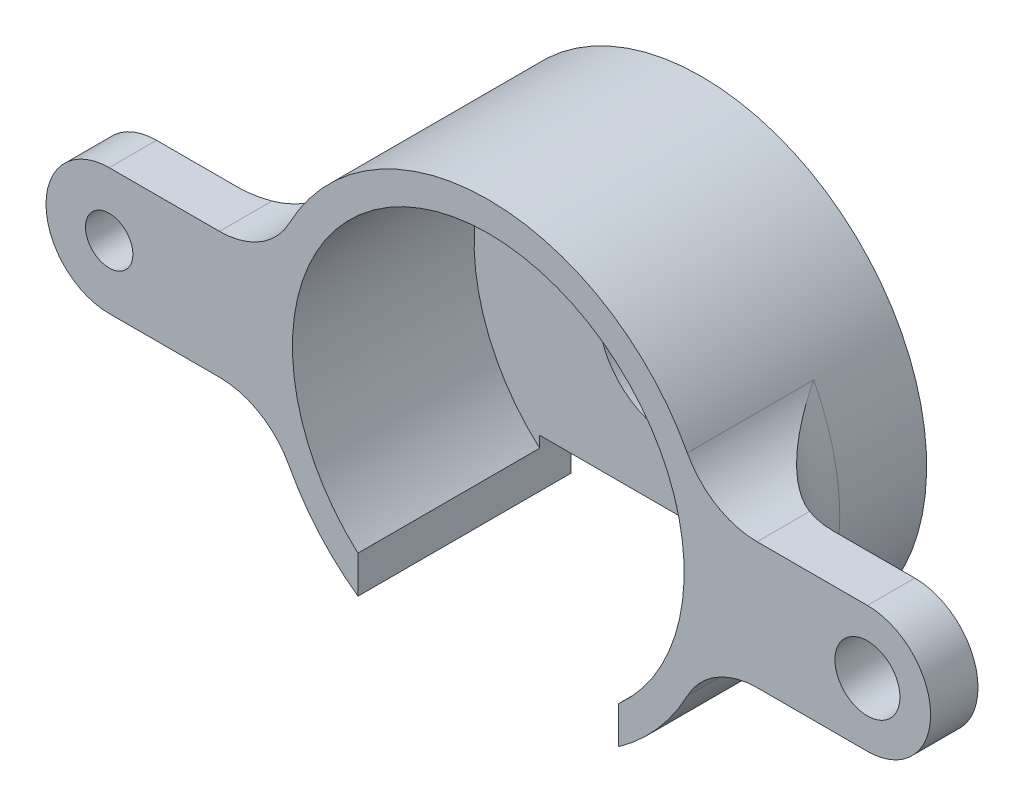
ISO-10303-21;
HEADER;
FILE_DESCRIPTION(('STEP AP214'),'2;1');
FILE_NAME('part.step','',(''),(''),'','','');
FILE_SCHEMA(('AUTOMOTIVE_DESIGN { 1 0 10303 214 1 1 1 1 }'));
ENDSEC;
DATA;
#1=APPLICATION_CONTEXT('core data for automotive mechanical design processes');
#2=APPLICATION_PROTOCOL_DEFINITION('international standard','automotive_design',2000,#1);
#3=PRODUCT_CONTEXT('',#1,'mechanical');
#4=PRODUCT('Part','Part','',(#3));
#5=PRODUCT_RELATED_PRODUCT_CATEGORY('part','',(#4));
#6=PRODUCT_DEFINITION_FORMATION('','',#4);
#7=PRODUCT_DEFINITION_CONTEXT('part definition',#1,'design');
#8=PRODUCT_DEFINITION('design','',#6,#7);
#9=PRODUCT_DEFINITION_SHAPE('','',#8);
#10=(LENGTH_UNIT() NAMED_UNIT(*) SI_UNIT(.MILLI.,.METRE.));
#11=(NAMED_UNIT(*) PLANE_ANGLE_UNIT() SI_UNIT($,.RADIAN.));
#12=(NAMED_UNIT(*) SI_UNIT($,.STERADIAN.) SOLID_ANGLE_UNIT());
#13=UNCERTAINTY_MEASURE_WITH_UNIT(LENGTH_MEASURE(1.E-05),#10,'distance_accuracy_value','');
#14=(GEOMETRIC_REPRESENTATION_CONTEXT(3) GLOBAL_UNCERTAINTY_ASSIGNED_CONTEXT((#13)) GLOBAL_UNIT_ASSIGNED_CONTEXT((#10,
#11,#12)) REPRESENTATION_CONTEXT('',''));
#15=CARTESIAN_POINT('',(0.,0.,0.));
#16=DIRECTION('',(0.,0.,1.));
#17=DIRECTION('',(1.,0.,0.));
#18=AXIS2_PLACEMENT_3D('',#15,#16,#17);
#19=CARTESIAN_POINT('',(0.,0.,11.5));
#20=DIRECTION('',(0.,0.,-1.));
#21=DIRECTION('',(-1.,0.,0.));
#22=AXIS2_PLACEMENT_3D('',#19,#20,#21);
#23=CYLINDRICAL_SURFACE('',#22,14.25);
#24=CARTESIAN_POINT('',(0.,0.,11.5));
#25=DIRECTION('',(0.,0.,1.));
#26=DIRECTION('',(1.,0.,0.));
#27=AXIS2_PLACEMENT_3D('',#24,#25,#26);
#28=CIRCLE('',#27,14.25);
#29=CARTESIAN_POINT('',(-12.5966565751789,-6.66233766233766,11.5));
#30=VERTEX_POINT('',#29);
#31=CARTESIAN_POINT('',(-8.25,-11.6189500386223,11.5));
#32=VERTEX_POINT('',#31);
#33=EDGE_CURVE('E330',#30,#32,#28,.T.);
#34=ORIENTED_EDGE('',*,*,#33,.F.);
#35=DIRECTION('',(0.,0.,-1.));
#36=VECTOR('',#35,1.);
#37=CARTESIAN_POINT('',(-12.5966565751789,-6.66233766233766,11.5));
#38=LINE('',#37,#36);
#39=CARTESIAN_POINT('',(-12.5966565751789,-6.66233766233766,3.5));
#40=VERTEX_POINT('',#39);
#41=EDGE_CURVE('E356',#30,#40,#38,.T.);
#42=ORIENTED_EDGE('',*,*,#41,.T.);
#43=CARTESIAN_POINT('',(0.,0.,3.5));
#44=DIRECTION('',(0.,0.,1.));
#45=DIRECTION('',(1.,0.,0.));
#46=AXIS2_PLACEMENT_3D('',#43,#44,#45);
#47=CIRCLE('',#46,14.25);
#48=CARTESIAN_POINT('',(-12.5966565751789,6.66233766233766,3.5));
#49=VERTEX_POINT('',#48);
#50=EDGE_CURVE('E354',#40,#49,#47,.F.);
#51=ORIENTED_EDGE('',*,*,#50,.T.);
#52=DIRECTION('',(0.,0.,-1.));
#53=VECTOR('',#52,1.);
#54=CARTESIAN_POINT('',(-12.5966565751789,6.66233766233766,11.5));
#55=LINE('',#54,#53);
#56=CARTESIAN_POINT('',(-12.5966565751789,6.66233766233766,11.5));
#57=VERTEX_POINT('',#56);
#58=EDGE_CURVE('E352',#49,#57,#55,.F.);
#59=ORIENTED_EDGE('',*,*,#58,.T.);
#60=CARTESIAN_POINT('',(12.5966565751789,6.66233766233766,11.5));
#61=VERTEX_POINT('',#60);
#62=EDGE_CURVE('E336',#61,#57,#28,.T.);
#63=ORIENTED_EDGE('',*,*,#62,.F.);
#64=DIRECTION('',(0.,0.,-1.));
#65=VECTOR('',#64,1.);
#66=CARTESIAN_POINT('',(12.5966565751789,6.66233766233766,11.5));
#67=LINE('',#66,#65);
#68=CARTESIAN_POINT('',(12.5966565751789,6.66233766233766,3.5));
#69=VERTEX_POINT('',#68);
#70=EDGE_CURVE('E350',#61,#69,#67,.T.);
#71=ORIENTED_EDGE('',*,*,#70,.T.);
#72=CARTESIAN_POINT('',(0.,0.,3.5));
#73=DIRECTION('',(0.,0.,1.));
#74=DIRECTION('',(1.,0.,0.));
#75=AXIS2_PLACEMENT_3D('',#72,#73,#74);
#76=CIRCLE('',#75,14.25);
#77=CARTESIAN_POINT('',(12.5966565751789,-6.66233766233766,3.5));
#78=VERTEX_POINT('',#77);
#79=EDGE_CURVE('E348',#69,#78,#76,.F.);
#80=ORIENTED_EDGE('',*,*,#79,.T.);
#81=DIRECTION('',(0.,0.,-1.));
#82=VECTOR('',#81,1.);
#83=CARTESIAN_POINT('',(12.5966565751789,-6.66233766233766,11.5));
#84=LINE('',#83,#82);
#85=CARTESIAN_POINT('',(12.5966565751789,-6.66233766233766,11.5));
#86=VERTEX_POINT('',#85);
#87=EDGE_CURVE('E346',#78,#86,#84,.F.);
#88=ORIENTED_EDGE('',*,*,#87,.T.);
#89=CARTESIAN_POINT('',(8.25,-11.6189500386223,11.5));
#90=VERTEX_POINT('',#89);
#91=EDGE_CURVE('E333',#90,#86,#28,.T.);
#92=ORIENTED_EDGE('',*,*,#91,.F.);
#93=DIRECTION('',(0.,0.,-1.));
#94=VECTOR('',#93,1.);
#95=CARTESIAN_POINT('',(8.25,-11.6189500386223,11.5));
#96=LINE('',#95,#94);
#97=CARTESIAN_POINT('',(8.25,-11.6189500386223,-2.));
#98=VERTEX_POINT('',#97);
#99=EDGE_CURVE('E303',#90,#98,#96,.T.);
#100=ORIENTED_EDGE('',*,*,#99,.T.);
#101=CARTESIAN_POINT('',(0.,0.,-2.));
#102=DIRECTION('',(0.,0.,-1.));
#103=DIRECTION('',(-1.,0.,0.));
#104=AXIS2_PLACEMENT_3D('',#101,#102,#103);
#105=CIRCLE('',#104,14.25);
#106=CARTESIAN_POINT('',(-8.25,-11.6189500386223,-2.));
#107=VERTEX_POINT('',#106);
#108=EDGE_CURVE('E312',#107,#98,#105,.T.);
#109=ORIENTED_EDGE('',*,*,#108,.F.);
#110=DIRECTION('',(0.,0.,-1.));
#111=VECTOR('',#110,1.);
#112=CARTESIAN_POINT('',(-8.25,-11.6189500386223,11.5));
#113=LINE('',#112,#111);
#114=EDGE_CURVE('E295',#107,#32,#113,.F.);
#115=ORIENTED_EDGE('',*,*,#114,.T.);
#116=EDGE_LOOP('',(#34,#42,#51,#59,#63,#71,#80,#88,#92,#100,#109,#115));
#117=FACE_BOUND('',#116,.T.);
#118=ADVANCED_FACE('F70',(#117),#23,.T.);
#119=CARTESIAN_POINT('',(0.,0.,11.5));
#120=DIRECTION('',(0.,0.,1.));
#121=DIRECTION('',(1.,0.,0.));
#122=AXIS2_PLACEMENT_3D('',#119,#120,#121);
#123=PLANE('',#122);
#124=DIRECTION('',(0.,1.,0.));
#125=VECTOR('',#124,1.);
#126=CARTESIAN_POINT('',(8.25,-16.2559009205842,11.5));
#127=LINE('',#126,#125);
#128=CARTESIAN_POINT('',(8.25,-9.25729442115784,11.5));
#129=VERTEX_POINT('',#128);
#130=EDGE_CURVE('E280',#90,#129,#127,.T.);
#131=ORIENTED_EDGE('',*,*,#130,.F.);
#132=ORIENTED_EDGE('',*,*,#91,.T.);
#133=CARTESIAN_POINT('',(17.0165360752416,-9.,11.5));
#134=DIRECTION('',(0.,0.,1.));
#135=DIRECTION('',(1.,0.,0.));
#136=AXIS2_PLACEMENT_3D('',#133,#134,#135);
#137=CIRCLE('',#136,5.);
#138=CARTESIAN_POINT('',(17.0165360752416,-4.,11.5));
#139=VERTEX_POINT('',#138);
#140=EDGE_CURVE('E12',#86,#139,#137,.F.);
#141=ORIENTED_EDGE('',*,*,#140,.T.);
#142=DIRECTION('',(1.,0.,0.));
#143=VECTOR('',#142,1.);
#144=CARTESIAN_POINT('',(13.6770793665899,-4.,11.5));
#145=LINE('',#144,#143);
#146=CARTESIAN_POINT('',(24.,-4.,11.5));
#147=VERTEX_POINT('',#146);
#148=EDGE_CURVE('E214',#139,#147,#145,.T.);
#149=ORIENTED_EDGE('',*,*,#148,.T.);
#150=CARTESIAN_POINT('',(24.,0.,11.5));
#151=DIRECTION('',(0.,0.,1.));
#152=DIRECTION('',(1.,0.,0.));
#153=AXIS2_PLACEMENT_3D('',#150,#151,#152);
#154=CIRCLE('',#153,4.);
#155=CARTESIAN_POINT('',(24.,4.,11.5));
#156=VERTEX_POINT('',#155);
#157=EDGE_CURVE('E221',#147,#156,#154,.T.);
#158=ORIENTED_EDGE('',*,*,#157,.T.);
#159=DIRECTION('',(1.,0.,0.));
#160=VECTOR('',#159,1.);
#161=CARTESIAN_POINT('',(13.6770793665899,4.,11.5));
#162=LINE('',#161,#160);
#163=CARTESIAN_POINT('',(17.0165360752416,4.,11.5));
#164=VERTEX_POINT('',#163);
#165=EDGE_CURVE('E239',#164,#156,#162,.T.);
#166=ORIENTED_EDGE('',*,*,#165,.F.);
#167=CARTESIAN_POINT('',(17.0165360752416,9.,11.5));
#168=DIRECTION('',(0.,0.,1.));
#169=DIRECTION('',(1.,0.,0.));
#170=AXIS2_PLACEMENT_3D('',#167,#168,#169);
#171=CIRCLE('',#170,5.);
#172=EDGE_CURVE('E485',#164,#61,#171,.F.);
#173=ORIENTED_EDGE('',*,*,#172,.T.);
#174=ORIENTED_EDGE('',*,*,#62,.T.);
#175=CARTESIAN_POINT('',(-17.0165360752416,9.,11.5));
#176=DIRECTION('',(0.,0.,1.));
#177=DIRECTION('',(1.,0.,0.));
#178=AXIS2_PLACEMENT_3D('',#175,#176,#177);
#179=CIRCLE('',#178,5.);
#180=CARTESIAN_POINT('',(-17.0165360752416,4.,11.5));
#181=VERTEX_POINT('',#180);
#182=EDGE_CURVE('E532',#57,#181,#179,.F.);
#183=ORIENTED_EDGE('',*,*,#182,.T.);
#184=DIRECTION('',(1.,0.,0.));
#185=VECTOR('',#184,1.);
#186=CARTESIAN_POINT('',(-24.,4.,11.5));
#187=LINE('',#186,#185);
#188=CARTESIAN_POINT('',(-24.,4.,11.5));
#189=VERTEX_POINT('',#188);
#190=EDGE_CURVE('E264',#189,#181,#187,.T.);
#191=ORIENTED_EDGE('',*,*,#190,.F.);
#192=CARTESIAN_POINT('',(-24.,0.,11.5));
#193=DIRECTION('',(0.,0.,1.));
#194=DIRECTION('',(1.,0.,0.));
#195=AXIS2_PLACEMENT_3D('',#192,#193,#194);
#196=CIRCLE('',#195,4.);
#197=CARTESIAN_POINT('',(-24.,-4.,11.5));
#198=VERTEX_POINT('',#197);
#199=EDGE_CURVE('E257',#189,#198,#196,.T.);
#200=ORIENTED_EDGE('',*,*,#199,.T.);
#201=DIRECTION('',(1.,0.,0.));
#202=VECTOR('',#201,1.);
#203=CARTESIAN_POINT('',(-24.,-4.,11.5));
#204=LINE('',#203,#202);
#205=CARTESIAN_POINT('',(-17.0165360752416,-4.,11.5));
#206=VERTEX_POINT('',#205);
#207=EDGE_CURVE('E273',#198,#206,#204,.T.);
#208=ORIENTED_EDGE('',*,*,#207,.T.);
#209=CARTESIAN_POINT('',(-17.0165360752416,-9.,11.5));
#210=DIRECTION('',(0.,0.,1.));
#211=DIRECTION('',(1.,0.,0.));
#212=AXIS2_PLACEMENT_3D('',#209,#210,#211);
#213=CIRCLE('',#212,5.);
#214=EDGE_CURVE('E366',#206,#30,#213,.F.);
#215=ORIENTED_EDGE('',*,*,#214,.T.);
#216=ORIENTED_EDGE('',*,*,#33,.T.);
#217=DIRECTION('',(0.,-1.,0.));
#218=VECTOR('',#217,1.);
#219=CARTESIAN_POINT('',(-8.25,-16.2559009205842,11.5));
#220=LINE('',#219,#218);
#221=CARTESIAN_POINT('',(-8.25,-9.25729442115784,11.5));
#222=VERTEX_POINT('',#221);
#223=EDGE_CURVE('E283',#222,#32,#220,.T.);
#224=ORIENTED_EDGE('',*,*,#223,.F.);
#225=CARTESIAN_POINT('',(0.,0.,11.5));
#226=DIRECTION('',(0.,0.,1.));
#227=DIRECTION('',(1.,0.,0.));
#228=AXIS2_PLACEMENT_3D('',#225,#226,#227);
#229=CIRCLE('',#228,12.4);
#230=EDGE_CURVE('E327',#129,#222,#229,.T.);
#231=ORIENTED_EDGE('',*,*,#230,.F.);
#232=EDGE_LOOP('',(#131,#132,#141,#149,#158,#166,#173,#174,#183,#191,#200,#208,#215,#216,#224,#231));
#233=FACE_BOUND('',#232,.T.);
#234=CARTESIAN_POINT('',(-24.,0.,11.5));
#235=DIRECTION('',(0.,0.,1.));
#236=DIRECTION('',(1.,0.,0.));
#237=AXIS2_PLACEMENT_3D('',#234,#235,#236);
#238=CIRCLE('',#237,1.5);
#239=CARTESIAN_POINT('',(-22.5,0.,11.5));
#240=VERTEX_POINT('',#239);
#241=EDGE_CURVE('E251',#240,#240,#238,.T.);
#242=ORIENTED_EDGE('',*,*,#241,.F.);
#243=EDGE_LOOP('',(#242));
#244=FACE_BOUND('',#243,.T.);
#245=CARTESIAN_POINT('',(24.,0.,11.5));
#246=DIRECTION('',(0.,0.,1.));
#247=DIRECTION('',(1.,0.,0.));
#248=AXIS2_PLACEMENT_3D('',#245,#246,#247);
#249=CIRCLE('',#248,2.05837794320438);
#250=CARTESIAN_POINT('',(26.0583779432044,0.,11.5));
#251=VERTEX_POINT('',#250);
#252=EDGE_CURVE('E248',#251,#251,#249,.T.);
#253=ORIENTED_EDGE('',*,*,#252,.F.);
#254=EDGE_LOOP('',(#253));
#255=FACE_BOUND('',#254,.T.);
#256=ADVANCED_FACE('F217',(#233,#244,#255),#123,.T.);
#257=CARTESIAN_POINT('',(0.,0.,11.5));
#258=DIRECTION('',(0.,0.,-1.));
#259=DIRECTION('',(-1.,0.,0.));
#260=AXIS2_PLACEMENT_3D('',#257,#258,#259);
#261=CYLINDRICAL_SURFACE('',#260,12.4);
#262=DIRECTION('',(0.,0.,-1.));
#263=VECTOR('',#262,1.);
#264=CARTESIAN_POINT('',(8.25,-9.25729442115784,11.5));
#265=LINE('',#264,#263);
#266=CARTESIAN_POINT('',(8.25,-9.25729442115784,0.));
#267=VERTEX_POINT('',#266);
#268=EDGE_CURVE('E309',#129,#267,#265,.T.);
#269=ORIENTED_EDGE('',*,*,#268,.F.);
#270=ORIENTED_EDGE('',*,*,#230,.T.);
#271=DIRECTION('',(0.,0.,-1.));
#272=VECTOR('',#271,1.);
#273=CARTESIAN_POINT('',(-8.25,-9.25729442115784,11.5));
#274=LINE('',#273,#272);
#275=CARTESIAN_POINT('',(-8.25,-9.25729442115784,0.));
#276=VERTEX_POINT('',#275);
#277=EDGE_CURVE('E301',#276,#222,#274,.F.);
#278=ORIENTED_EDGE('',*,*,#277,.F.);
#279=CARTESIAN_POINT('',(0.,0.,0.));
#280=DIRECTION('',(0.,0.,1.));
#281=DIRECTION('',(1.,0.,0.));
#282=AXIS2_PLACEMENT_3D('',#279,#280,#281);
#283=CIRCLE('',#282,12.4);
#284=EDGE_CURVE('E322',#267,#276,#283,.T.);
#285=ORIENTED_EDGE('',*,*,#284,.F.);
#286=EDGE_LOOP('',(#269,#270,#278,#285));
#287=FACE_BOUND('',#286,.T.);
#288=ADVANCED_FACE('F422',(#287),#261,.F.);
#289=CARTESIAN_POINT('',(0.,0.,0.));
#290=DIRECTION('',(0.,0.,-1.));
#291=DIRECTION('',(-1.,0.,0.));
#292=AXIS2_PLACEMENT_3D('',#289,#290,#291);
#293=PLANE('',#292);
#294=CARTESIAN_POINT('',(0.,0.,0.));
#295=DIRECTION('',(0.,0.,-1.));
#296=DIRECTION('',(-1.,0.,0.));
#297=AXIS2_PLACEMENT_3D('',#294,#295,#296);
#298=CIRCLE('',#297,4.5);
#299=CARTESIAN_POINT('',(-4.5,0.,0.));
#300=VERTEX_POINT('',#299);
#301=EDGE_CURVE('E316',#300,#300,#298,.T.);
#302=ORIENTED_EDGE('',*,*,#301,.T.);
#303=EDGE_LOOP('',(#302));
#304=FACE_BOUND('',#303,.T.);
#305=CARTESIAN_POINT('',(10.,0.,0.));
#306=DIRECTION('',(0.,0.,-1.));
#307=DIRECTION('',(-1.,0.,0.));
#308=AXIS2_PLACEMENT_3D('',#305,#306,#307);
#309=CIRCLE('',#308,1.5);
#310=CARTESIAN_POINT('',(8.5,0.,0.));
#311=VERTEX_POINT('',#310);
#312=EDGE_CURVE('E311',#311,#311,#309,.T.);
#313=ORIENTED_EDGE('',*,*,#312,.T.);
#314=EDGE_LOOP('',(#313));
#315=FACE_BOUND('',#314,.T.);
#316=DIRECTION('',(1.,0.,0.));
#317=VECTOR('',#316,1.);
#318=CARTESIAN_POINT('',(0.,-8.54409907941579,0.));
#319=LINE('',#318,#317);
#320=CARTESIAN_POINT('',(-8.25,-8.54409907941579,0.));
#321=VERTEX_POINT('',#320);
#322=CARTESIAN_POINT('',(8.25,-8.54409907941579,0.));
#323=VERTEX_POINT('',#322);
#324=EDGE_CURVE('E290',#321,#323,#319,.T.);
#325=ORIENTED_EDGE('',*,*,#324,.T.);
#326=DIRECTION('',(0.,-1.,0.));
#327=VECTOR('',#326,1.);
#328=CARTESIAN_POINT('',(8.25,0.,0.));
#329=LINE('',#328,#327);
#330=EDGE_CURVE('E306',#323,#267,#329,.T.);
#331=ORIENTED_EDGE('',*,*,#330,.T.);
#332=ORIENTED_EDGE('',*,*,#284,.T.);
#333=DIRECTION('',(0.,1.,0.));
#334=VECTOR('',#333,1.);
#335=CARTESIAN_POINT('',(-8.25,0.,0.));
#336=LINE('',#335,#334);
#337=EDGE_CURVE('E298',#276,#321,#336,.T.);
#338=ORIENTED_EDGE('',*,*,#337,.T.);
#339=EDGE_LOOP('',(#325,#331,#332,#338));
#340=FACE_BOUND('',#339,.T.);
#341=ADVANCED_FACE('F418',(#304,#315,#340),#293,.F.);
#342=CARTESIAN_POINT('',(10.,0.,-2.));
#343=DIRECTION('',(0.,0.,1.));
#344=DIRECTION('',(1.,0.,0.));
#345=AXIS2_PLACEMENT_3D('',#342,#343,#344);
#346=CYLINDRICAL_SURFACE('',#345,1.5);
#347=CARTESIAN_POINT('',(10.,0.,-2.));
#348=DIRECTION('',(0.,0.,-1.));
#349=DIRECTION('',(-1.,0.,0.));
#350=AXIS2_PLACEMENT_3D('',#347,#348,#349);
#351=CIRCLE('',#350,1.5);
#352=CARTESIAN_POINT('',(8.5,0.,-2.));
#353=VERTEX_POINT('',#352);
#354=EDGE_CURVE('E315',#353,#353,#351,.T.);
#355=ORIENTED_EDGE('',*,*,#354,.T.);
#356=EDGE_LOOP('',(#355));
#357=FACE_BOUND('',#356,.T.);
#358=ORIENTED_EDGE('',*,*,#312,.F.);
#359=EDGE_LOOP('',(#358));
#360=FACE_BOUND('',#359,.T.);
#361=ADVANCED_FACE('F421',(#357,#360),#346,.F.);
#362=CARTESIAN_POINT('',(0.,0.,-2.));
#363=DIRECTION('',(0.,0.,1.));
#364=DIRECTION('',(1.,0.,0.));
#365=AXIS2_PLACEMENT_3D('',#362,#363,#364);
#366=CYLINDRICAL_SURFACE('',#365,4.5);
#367=CARTESIAN_POINT('',(0.,0.,-2.));
#368=DIRECTION('',(0.,0.,-1.));
#369=DIRECTION('',(-1.,0.,0.));
#370=AXIS2_PLACEMENT_3D('',#367,#368,#369);
#371=CIRCLE('',#370,4.5);
#372=CARTESIAN_POINT('',(-4.5,0.,-2.));
#373=VERTEX_POINT('',#372);
#374=EDGE_CURVE('E319',#373,#373,#371,.T.);
#375=ORIENTED_EDGE('',*,*,#374,.T.);
#376=EDGE_LOOP('',(#375));
#377=FACE_BOUND('',#376,.T.);
#378=ORIENTED_EDGE('',*,*,#301,.F.);
#379=EDGE_LOOP('',(#378));
#380=FACE_BOUND('',#379,.T.);
#381=ADVANCED_FACE('F416',(#377,#380),#366,.F.);
#382=CARTESIAN_POINT('',(0.,0.,-2.));
#383=DIRECTION('',(0.,0.,-1.));
#384=DIRECTION('',(-1.,0.,0.));
#385=AXIS2_PLACEMENT_3D('',#382,#383,#384);
#386=PLANE('',#385);
#387=DIRECTION('',(0.,-1.,0.));
#388=VECTOR('',#387,1.);
#389=CARTESIAN_POINT('',(8.25,0.,-2.));
#390=LINE('',#389,#388);
#391=CARTESIAN_POINT('',(8.25,-8.54409907941579,-2.));
#392=VERTEX_POINT('',#391);
#393=EDGE_CURVE('E341',#392,#98,#390,.T.);
#394=ORIENTED_EDGE('',*,*,#393,.F.);
#395=DIRECTION('',(1.,0.,0.));
#396=VECTOR('',#395,1.);
#397=CARTESIAN_POINT('',(0.,-8.54409907941579,-2.));
#398=LINE('',#397,#396);
#399=CARTESIAN_POINT('',(-8.25,-8.54409907941579,-2.));
#400=VERTEX_POINT('',#399);
#401=EDGE_CURVE('E335',#400,#392,#398,.T.);
#402=ORIENTED_EDGE('',*,*,#401,.F.);
#403=DIRECTION('',(0.,1.,0.));
#404=VECTOR('',#403,1.);
#405=CARTESIAN_POINT('',(-8.25,0.,-2.));
#406=LINE('',#405,#404);
#407=EDGE_CURVE('E338',#107,#400,#406,.T.);
#408=ORIENTED_EDGE('',*,*,#407,.F.);
#409=ORIENTED_EDGE('',*,*,#108,.T.);
#410=EDGE_LOOP('',(#394,#402,#408,#409));
#411=FACE_BOUND('',#410,.T.);
#412=ORIENTED_EDGE('',*,*,#354,.F.);
#413=EDGE_LOOP('',(#412));
#414=FACE_BOUND('',#413,.T.);
#415=ORIENTED_EDGE('',*,*,#374,.F.);
#416=EDGE_LOOP('',(#415));
#417=FACE_BOUND('',#416,.T.);
#418=ADVANCED_FACE('F412',(#411,#414,#417),#386,.T.);
#419=CARTESIAN_POINT('',(8.25,-16.2559009205842,-7.5));
#420=DIRECTION('',(1.,0.,0.));
#421=DIRECTION('',(0.,0.,-1.));
#422=AXIS2_PLACEMENT_3D('',#419,#420,#421);
#423=PLANE('',#422);
#424=ORIENTED_EDGE('',*,*,#268,.T.);
#425=ORIENTED_EDGE('',*,*,#330,.F.);
#426=DIRECTION('',(0.,0.,1.));
#427=VECTOR('',#426,1.);
#428=CARTESIAN_POINT('',(8.25,-8.54409907941579,-7.5));
#429=LINE('',#428,#427);
#430=EDGE_CURVE('E286',#392,#323,#429,.T.);
#431=ORIENTED_EDGE('',*,*,#430,.F.);
#432=ORIENTED_EDGE('',*,*,#393,.T.);
#433=ORIENTED_EDGE('',*,*,#99,.F.);
#434=ORIENTED_EDGE('',*,*,#130,.T.);
#435=EDGE_LOOP('',(#424,#425,#431,#432,#433,#434));
#436=FACE_BOUND('',#435,.T.);
#437=ADVANCED_FACE('F405',(#436),#423,.F.);
#438=CARTESIAN_POINT('',(-8.25,-16.2559009205842,-7.5));
#439=DIRECTION('',(-1.,0.,0.));
#440=DIRECTION('',(0.,0.,1.));
#441=AXIS2_PLACEMENT_3D('',#438,#439,#440);
#442=PLANE('',#441);
#443=ORIENTED_EDGE('',*,*,#277,.T.);
#444=ORIENTED_EDGE('',*,*,#223,.T.);
#445=ORIENTED_EDGE('',*,*,#114,.F.);
#446=ORIENTED_EDGE('',*,*,#407,.T.);
#447=DIRECTION('',(0.,0.,1.));
#448=VECTOR('',#447,1.);
#449=CARTESIAN_POINT('',(-8.25,-8.54409907941579,-7.5));
#450=LINE('',#449,#448);
#451=EDGE_CURVE('E287',#400,#321,#450,.T.);
#452=ORIENTED_EDGE('',*,*,#451,.T.);
#453=ORIENTED_EDGE('',*,*,#337,.F.);
#454=EDGE_LOOP('',(#443,#444,#445,#446,#452,#453));
#455=FACE_BOUND('',#454,.T.);
#456=ADVANCED_FACE('F402',(#455),#442,.F.);
#457=CARTESIAN_POINT('',(-8.25,-8.54409907941579,-7.5));
#458=DIRECTION('',(0.,1.,0.));
#459=DIRECTION('',(0.,0.,1.));
#460=AXIS2_PLACEMENT_3D('',#457,#458,#459);
#461=PLANE('',#460);
#462=ORIENTED_EDGE('',*,*,#451,.F.);
#463=ORIENTED_EDGE('',*,*,#401,.T.);
#464=ORIENTED_EDGE('',*,*,#430,.T.);
#465=ORIENTED_EDGE('',*,*,#324,.F.);
#466=EDGE_LOOP('',(#462,#463,#464,#465));
#467=FACE_BOUND('',#466,.T.);
#468=ADVANCED_FACE('F400',(#467),#461,.F.);
#469=CARTESIAN_POINT('',(-24.,0.,8.5));
#470=DIRECTION('',(0.,0.,1.));
#471=DIRECTION('',(1.,0.,0.));
#472=AXIS2_PLACEMENT_3D('',#469,#470,#471);
#473=CYLINDRICAL_SURFACE('',#472,4.);
#474=ORIENTED_EDGE('',*,*,#199,.F.);
#475=DIRECTION('',(0.,0.,1.));
#476=VECTOR('',#475,1.);
#477=CARTESIAN_POINT('',(-24.,4.,8.5));
#478=LINE('',#477,#476);
#479=CARTESIAN_POINT('',(-24.,4.,8.5));
#480=VERTEX_POINT('',#479);
#481=EDGE_CURVE('E278',#480,#189,#478,.T.);
#482=ORIENTED_EDGE('',*,*,#481,.F.);
#483=CARTESIAN_POINT('',(-24.,0.,8.5));
#484=DIRECTION('',(0.,0.,1.));
#485=DIRECTION('',(1.,0.,0.));
#486=AXIS2_PLACEMENT_3D('',#483,#484,#485);
#487=CIRCLE('',#486,4.);
#488=CARTESIAN_POINT('',(-24.,-4.,8.5));
#489=VERTEX_POINT('',#488);
#490=EDGE_CURVE('E260',#480,#489,#487,.T.);
#491=ORIENTED_EDGE('',*,*,#490,.T.);
#492=DIRECTION('',(0.,0.,1.));
#493=VECTOR('',#492,1.);
#494=CARTESIAN_POINT('',(-24.,-4.,8.5));
#495=LINE('',#494,#493);
#496=EDGE_CURVE('E270',#489,#198,#495,.T.);
#497=ORIENTED_EDGE('',*,*,#496,.T.);
#498=EDGE_LOOP('',(#474,#482,#491,#497));
#499=FACE_BOUND('',#498,.T.);
#500=ADVANCED_FACE('F397',(#499),#473,.T.);
#501=CARTESIAN_POINT('',(-24.,4.,8.5));
#502=DIRECTION('',(0.,-1.,0.));
#503=DIRECTION('',(0.,0.,-1.));
#504=AXIS2_PLACEMENT_3D('',#501,#502,#503);
#505=PLANE('',#504);
#506=ORIENTED_EDGE('',*,*,#190,.T.);
#507=DIRECTION('',(0.,0.,1.));
#508=VECTOR('',#507,1.);
#509=CARTESIAN_POINT('',(-17.0165360752416,4.,8.5));
#510=LINE('',#509,#508);
#511=CARTESIAN_POINT('',(-17.0165360752416,4.,8.17635810186876));
#512=VERTEX_POINT('',#511);
#513=EDGE_CURVE('E360',#181,#512,#510,.F.);
#514=ORIENTED_EDGE('',*,*,#513,.T.);
#515=CARTESIAN_POINT('',(-17.0165360752416,4.,8.17635810186876));
#516=CARTESIAN_POINT('',(-17.161873898164,4.,8.22991384078425));
#517=CARTESIAN_POINT('',(-17.3095882895959,4.,8.27700937210215));
#518=CARTESIAN_POINT('',(-17.6074423507247,4.,8.35767135598129));
#519=CARTESIAN_POINT('',(-17.7575545160994,4.,8.39133938535494));
#520=CARTESIAN_POINT('',(-18.0601616612048,4.,8.44537356076521));
#521=CARTESIAN_POINT('',(-18.21265674324,4.,8.46573913407929));
#522=CARTESIAN_POINT('',(-18.520036257062,4.,8.49311269132856));
#523=CARTESIAN_POINT('',(-18.6749300476301,4.,8.50001558130392));
#524=CARTESIAN_POINT('',(-18.8298300576506,4.,8.5));
#525=B_SPLINE_CURVE_WITH_KNOTS('',3,(#515,#516,#517,#518,#519,#520,#521,#522,#523,#524),
.UNSPECIFIED.,.F.,.F.,(4,2,2,2,4),(0.,0.464516793304799,0.925449725128462,1.38640250060249,
1.85093943978702),.UNSPECIFIED.);
#526=CARTESIAN_POINT('',(-18.8298300576505,4.,8.5));
#527=VERTEX_POINT('',#526);
#528=EDGE_CURVE('E377',#512,#527,#525,.T.);
#529=ORIENTED_EDGE('',*,*,#528,.T.);
#530=DIRECTION('',(1.,0.,0.));
#531=VECTOR('',#530,1.);
#532=CARTESIAN_POINT('',(-24.,4.,8.5));
#533=LINE('',#532,#531);
#534=EDGE_CURVE('E267',#480,#527,#533,.T.);
#535=ORIENTED_EDGE('',*,*,#534,.F.);
#536=ORIENTED_EDGE('',*,*,#481,.T.);
#537=EDGE_LOOP('',(#506,#514,#529,#535,#536));
#538=FACE_BOUND('',#537,.T.);
#539=ADVANCED_FACE('F393',(#538),#505,.F.);
#540=CARTESIAN_POINT('',(-24.,-4.,8.5));
#541=DIRECTION('',(0.,-1.,0.));
#542=DIRECTION('',(0.,0.,-1.));
#543=AXIS2_PLACEMENT_3D('',#540,#541,#542);
#544=PLANE('',#543);
#545=DIRECTION('',(1.,0.,0.));
#546=VECTOR('',#545,1.);
#547=CARTESIAN_POINT('',(-24.,-4.,8.5));
#548=LINE('',#547,#546);
#549=CARTESIAN_POINT('',(-18.8298300576505,-4.,8.5));
#550=VERTEX_POINT('',#549);
#551=EDGE_CURVE('E263',#489,#550,#548,.T.);
#552=ORIENTED_EDGE('',*,*,#551,.T.);
#553=CARTESIAN_POINT('',(-18.8298300576505,-4.00000000000004,8.5));
#554=CARTESIAN_POINT('',(-18.6749300476301,-4.00000000000001,8.50001558130392));
#555=CARTESIAN_POINT('',(-18.520036257062,-4.,8.49311269132856));
#556=CARTESIAN_POINT('',(-18.21265674324,-4.,8.46573913407929));
#557=CARTESIAN_POINT('',(-18.0601616612048,-4.,8.44537356076521));
#558=CARTESIAN_POINT('',(-17.7575545160994,-4.,8.39133938535494));
#559=CARTESIAN_POINT('',(-17.6074423507247,-4.,8.35767135598129));
#560=CARTESIAN_POINT('',(-17.3095882895959,-4.,8.27700937210215));
#561=CARTESIAN_POINT('',(-17.161873898164,-4.,8.22991384078425));
#562=CARTESIAN_POINT('',(-17.0165360752416,-4.,8.17635810186876));
#563=B_SPLINE_CURVE_WITH_KNOTS('',3,(#553,#554,#555,#556,#557,#558,#559,#560,#561,#562),
.UNSPECIFIED.,.F.,.F.,(4,2,2,2,4),(0.,0.464536939184529,0.925489714658558,1.38642264648222,
1.85093943978701),.UNSPECIFIED.);
#564=CARTESIAN_POINT('',(-17.0165360752416,-4.,8.17635810186876));
#565=VERTEX_POINT('',#564);
#566=EDGE_CURVE('E368',#550,#565,#563,.T.);
#567=ORIENTED_EDGE('',*,*,#566,.T.);
#568=DIRECTION('',(0.,0.,-1.));
#569=VECTOR('',#568,1.);
#570=CARTESIAN_POINT('',(-17.0165360752416,-4.,8.5));
#571=LINE('',#570,#569);
#572=EDGE_CURVE('E343',#565,#206,#571,.F.);
#573=ORIENTED_EDGE('',*,*,#572,.T.);
#574=ORIENTED_EDGE('',*,*,#207,.F.);
#575=ORIENTED_EDGE('',*,*,#496,.F.);
#576=EDGE_LOOP('',(#552,#567,#573,#574,#575));
#577=FACE_BOUND('',#576,.T.);
#578=ADVANCED_FACE('F388',(#577),#544,.T.);
#579=CARTESIAN_POINT('',(-24.,0.,8.5));
#580=DIRECTION('',(0.,0.,1.));
#581=DIRECTION('',(1.,0.,0.));
#582=AXIS2_PLACEMENT_3D('',#579,#580,#581);
#583=PLANE('',#582);
#584=CARTESIAN_POINT('',(-24.,0.,8.5));
#585=DIRECTION('',(0.,0.,1.));
#586=DIRECTION('',(1.,0.,0.));
#587=AXIS2_PLACEMENT_3D('',#584,#585,#586);
#588=CIRCLE('',#587,1.5);
#589=CARTESIAN_POINT('',(-22.5,0.,8.5));
#590=VERTEX_POINT('',#589);
#591=EDGE_CURVE('E254',#590,#590,#588,.T.);
#592=ORIENTED_EDGE('',*,*,#591,.T.);
#593=EDGE_LOOP('',(#592));
#594=FACE_BOUND('',#593,.T.);
#595=ORIENTED_EDGE('',*,*,#534,.T.);
#596=CARTESIAN_POINT('',(0.,0.,8.5));
#597=DIRECTION('',(0.,0.,1.));
#598=DIRECTION('',(1.,0.,0.));
#599=AXIS2_PLACEMENT_3D('',#596,#597,#598);
#600=CIRCLE('',#599,19.25);
#601=EDGE_CURVE('E358',#527,#550,#600,.T.);
#602=ORIENTED_EDGE('',*,*,#601,.T.);
#603=ORIENTED_EDGE('',*,*,#551,.F.);
#604=ORIENTED_EDGE('',*,*,#490,.F.);
#605=EDGE_LOOP('',(#595,#602,#603,#604));
#606=FACE_BOUND('',#605,.T.);
#607=ADVANCED_FACE('F392',(#594,#606),#583,.F.);
#608=CARTESIAN_POINT('',(-24.,0.,8.5));
#609=DIRECTION('',(0.,0.,1.));
#610=DIRECTION('',(1.,0.,0.));
#611=AXIS2_PLACEMENT_3D('',#608,#609,#610);
#612=CYLINDRICAL_SURFACE('',#611,1.5);
#613=ORIENTED_EDGE('',*,*,#591,.F.);
#614=EDGE_LOOP('',(#613));
#615=FACE_BOUND('',#614,.T.);
#616=ORIENTED_EDGE('',*,*,#241,.T.);
#617=EDGE_LOOP('',(#616));
#618=FACE_BOUND('',#617,.T.);
#619=ADVANCED_FACE('F495',(#615,#618),#612,.F.);
#620=CARTESIAN_POINT('',(13.6770793665899,4.,8.5));
#621=DIRECTION('',(0.,-1.,0.));
#622=DIRECTION('',(1.,0.,0.));
#623=AXIS2_PLACEMENT_3D('',#620,#621,#622);
#624=PLANE('',#623);
#625=DIRECTION('',(1.,0.,0.));
#626=VECTOR('',#625,1.);
#627=CARTESIAN_POINT('',(13.6770793665899,4.,8.5));
#628=LINE('',#627,#626);
#629=CARTESIAN_POINT('',(18.8298300576505,4.,8.5));
#630=VERTEX_POINT('',#629);
#631=CARTESIAN_POINT('',(24.,4.,8.5));
#632=VERTEX_POINT('',#631);
#633=EDGE_CURVE('E224',#630,#632,#628,.T.);
#634=ORIENTED_EDGE('',*,*,#633,.F.);
#635=CARTESIAN_POINT('',(18.8298300576505,4.,8.5));
#636=CARTESIAN_POINT('',(18.6749300476301,4.,8.50001558130392));
#637=CARTESIAN_POINT('',(18.520036257062,4.,8.49311269132856));
#638=CARTESIAN_POINT('',(18.21265674324,4.,8.46573913407929));
#639=CARTESIAN_POINT('',(18.0601616612048,4.,8.44537356076521));
#640=CARTESIAN_POINT('',(17.7575545160994,4.,8.39133938535494));
#641=CARTESIAN_POINT('',(17.6074423507247,4.,8.35767135598129));
#642=CARTESIAN_POINT('',(17.3095882895959,4.,8.27700937210215));
#643=CARTESIAN_POINT('',(17.161873898164,4.,8.22991384078425));
#644=CARTESIAN_POINT('',(17.0165360752416,4.,8.17635810186876));
#645=B_SPLINE_CURVE_WITH_KNOTS('',3,(#635,#636,#637,#638,#639,#640,#641,#642,#643,#644),
.UNSPECIFIED.,.F.,.F.,(4,2,2,2,4),(0.,0.464536939184533,0.925489714658562,1.38642264648222,
1.85093943978702),.UNSPECIFIED.);
#646=CARTESIAN_POINT('',(17.0165360752416,4.,8.17635810186876));
#647=VERTEX_POINT('',#646);
#648=EDGE_CURVE('E478',#630,#647,#645,.T.);
#649=ORIENTED_EDGE('',*,*,#648,.T.);
#650=DIRECTION('',(0.,0.,1.));
#651=VECTOR('',#650,1.);
#652=CARTESIAN_POINT('',(17.0165360752416,4.,11.5));
#653=LINE('',#652,#651);
#654=EDGE_CURVE('E100',#647,#164,#653,.T.);
#655=ORIENTED_EDGE('',*,*,#654,.T.);
#656=ORIENTED_EDGE('',*,*,#165,.T.);
#657=DIRECTION('',(0.,0.,1.));
#658=VECTOR('',#657,1.);
#659=CARTESIAN_POINT('',(24.,4.,8.5));
#660=LINE('',#659,#658);
#661=EDGE_CURVE('E234',#632,#156,#660,.T.);
#662=ORIENTED_EDGE('',*,*,#661,.F.);
#663=EDGE_LOOP('',(#634,#649,#655,#656,#662));
#664=FACE_BOUND('',#663,.T.);
#665=ADVANCED_FACE('F491',(#664),#624,.F.);
#666=CARTESIAN_POINT('',(24.,0.,8.5));
#667=DIRECTION('',(0.,0.,1.));
#668=DIRECTION('',(1.,0.,0.));
#669=AXIS2_PLACEMENT_3D('',#666,#667,#668);
#670=CYLINDRICAL_SURFACE('',#669,4.);
#671=ORIENTED_EDGE('',*,*,#157,.F.);
#672=DIRECTION('',(0.,0.,1.));
#673=VECTOR('',#672,1.);
#674=CARTESIAN_POINT('',(24.,-4.,8.5));
#675=LINE('',#674,#673);
#676=CARTESIAN_POINT('',(24.,-4.,8.5));
#677=VERTEX_POINT('',#676);
#678=EDGE_CURVE('E227',#677,#147,#675,.T.);
#679=ORIENTED_EDGE('',*,*,#678,.F.);
#680=CARTESIAN_POINT('',(24.,0.,8.5));
#681=DIRECTION('',(0.,0.,1.));
#682=DIRECTION('',(1.,0.,0.));
#683=AXIS2_PLACEMENT_3D('',#680,#681,#682);
#684=CIRCLE('',#683,4.);
#685=EDGE_CURVE('E245',#677,#632,#684,.T.);
#686=ORIENTED_EDGE('',*,*,#685,.T.);
#687=ORIENTED_EDGE('',*,*,#661,.T.);
#688=EDGE_LOOP('',(#671,#679,#686,#687));
#689=FACE_BOUND('',#688,.T.);
#690=ADVANCED_FACE('F237',(#689),#670,.T.);
#691=CARTESIAN_POINT('',(13.6770793665899,-4.,8.5));
#692=DIRECTION('',(0.,-1.,0.));
#693=DIRECTION('',(1.,0.,0.));
#694=AXIS2_PLACEMENT_3D('',#691,#692,#693);
#695=PLANE('',#694);
#696=ORIENTED_EDGE('',*,*,#148,.F.);
#697=DIRECTION('',(0.,0.,-1.));
#698=VECTOR('',#697,1.);
#699=CARTESIAN_POINT('',(17.0165360752416,-4.,8.5));
#700=LINE('',#699,#698);
#701=CARTESIAN_POINT('',(17.0165360752416,-4.,8.17635810186876));
#702=VERTEX_POINT('',#701);
#703=EDGE_CURVE('E92',#139,#702,#700,.T.);
#704=ORIENTED_EDGE('',*,*,#703,.T.);
#705=CARTESIAN_POINT('',(17.0165360752416,-4.,8.17635810186876));
#706=CARTESIAN_POINT('',(17.161873898164,-4.,8.22991384078425));
#707=CARTESIAN_POINT('',(17.3095882895959,-4.,8.27700937210215));
#708=CARTESIAN_POINT('',(17.6074423507247,-4.,8.35767135598129));
#709=CARTESIAN_POINT('',(17.7575545160994,-4.,8.39133938535494));
#710=CARTESIAN_POINT('',(18.0601616612048,-4.,8.44537356076521));
#711=CARTESIAN_POINT('',(18.21265674324,-4.,8.46573913407929));
#712=CARTESIAN_POINT('',(18.520036257062,-4.,8.49311269132856));
#713=CARTESIAN_POINT('',(18.6749300476301,-4.,8.50001558130392));
#714=CARTESIAN_POINT('',(18.8298300576506,-4.,8.5));
#715=B_SPLINE_CURVE_WITH_KNOTS('',3,(#705,#706,#707,#708,#709,#710,#711,#712,#713,#714),
.UNSPECIFIED.,.F.,.F.,(4,2,2,2,4),(0.,0.464516793304799,0.925449725128462,1.38640250060249,
1.85093943978702),.UNSPECIFIED.);
#716=CARTESIAN_POINT('',(18.8298300576505,-4.,8.5));
#717=VERTEX_POINT('',#716);
#718=EDGE_CURVE('E84',#702,#717,#715,.T.);
#719=ORIENTED_EDGE('',*,*,#718,.T.);
#720=DIRECTION('',(1.,0.,0.));
#721=VECTOR('',#720,1.);
#722=CARTESIAN_POINT('',(13.6770793665899,-4.,8.5));
#723=LINE('',#722,#721);
#724=EDGE_CURVE('E230',#717,#677,#723,.T.);
#725=ORIENTED_EDGE('',*,*,#724,.T.);
#726=ORIENTED_EDGE('',*,*,#678,.T.);
#727=EDGE_LOOP('',(#696,#704,#719,#725,#726));
#728=FACE_BOUND('',#727,.T.);
#729=ADVANCED_FACE('F228',(#728),#695,.T.);
#730=CARTESIAN_POINT('',(0.,0.,8.5));
#731=DIRECTION('',(0.,0.,1.));
#732=DIRECTION('',(1.,0.,0.));
#733=AXIS2_PLACEMENT_3D('',#730,#731,#732);
#734=PLANE('',#733);
#735=CARTESIAN_POINT('',(24.,0.,8.5));
#736=DIRECTION('',(0.,0.,1.));
#737=DIRECTION('',(1.,0.,0.));
#738=AXIS2_PLACEMENT_3D('',#735,#736,#737);
#739=CIRCLE('',#738,2.05837794320438);
#740=CARTESIAN_POINT('',(26.0583779432044,0.,8.5));
#741=VERTEX_POINT('',#740);
#742=EDGE_CURVE('E241',#741,#741,#739,.T.);
#743=ORIENTED_EDGE('',*,*,#742,.T.);
#744=EDGE_LOOP('',(#743));
#745=FACE_BOUND('',#744,.T.);
#746=ORIENTED_EDGE('',*,*,#724,.F.);
#747=CARTESIAN_POINT('',(0.,0.,8.5));
#748=DIRECTION('',(0.,0.,1.));
#749=DIRECTION('',(1.,0.,0.));
#750=AXIS2_PLACEMENT_3D('',#747,#748,#749);
#751=CIRCLE('',#750,19.25);
#752=EDGE_CURVE('E363',#717,#630,#751,.T.);
#753=ORIENTED_EDGE('',*,*,#752,.T.);
#754=ORIENTED_EDGE('',*,*,#633,.T.);
#755=ORIENTED_EDGE('',*,*,#685,.F.);
#756=EDGE_LOOP('',(#746,#753,#754,#755));
#757=FACE_BOUND('',#756,.T.);
#758=ADVANCED_FACE('F501',(#745,#757),#734,.F.);
#759=CARTESIAN_POINT('',(24.,0.,8.5));
#760=DIRECTION('',(0.,0.,1.));
#761=DIRECTION('',(1.,0.,0.));
#762=AXIS2_PLACEMENT_3D('',#759,#760,#761);
#763=CYLINDRICAL_SURFACE('',#762,2.05837794320438);
#764=ORIENTED_EDGE('',*,*,#742,.F.);
#765=EDGE_LOOP('',(#764));
#766=FACE_BOUND('',#765,.T.);
#767=ORIENTED_EDGE('',*,*,#252,.T.);
#768=EDGE_LOOP('',(#767));
#769=FACE_BOUND('',#768,.T.);
#770=ADVANCED_FACE('F465',(#766,#769),#763,.F.);
#771=CARTESIAN_POINT('',(-17.0165360752416,9.,11.5));
#772=DIRECTION('',(0.,0.,-1.));
#773=DIRECTION('',(-1.,0.,0.));
#774=AXIS2_PLACEMENT_3D('',#771,#772,#773);
#775=CYLINDRICAL_SURFACE('',#774,5.);
#776=ORIENTED_EDGE('',*,*,#182,.F.);
#777=ORIENTED_EDGE('',*,*,#58,.F.);
#778=CARTESIAN_POINT('',(-17.0165360752416,4.,8.17635810186876));
#779=CARTESIAN_POINT('',(-16.8799139560784,3.99998596276398,8.12606013129485));
#780=CARTESIAN_POINT('',(-16.7453778190466,4.00559713838729,8.07050147035477));
#781=CARTESIAN_POINT('',(-16.4816433930906,4.02694169136022,7.95022484979747));
#782=CARTESIAN_POINT('',(-16.3524336718605,4.04265204384503,7.88552798528382));
#783=CARTESIAN_POINT('',(-16.1015724039315,4.08280732689522,7.74901322121573));
#784=CARTESIAN_POINT('',(-15.9798430714809,4.10713304639945,7.67730172897059));
#785=CARTESIAN_POINT('',(-15.7424184109293,4.16352195701116,7.52711863935742));
#786=CARTESIAN_POINT('',(-15.6267273423603,4.19559052272955,7.44864237073091));
#787=CARTESIAN_POINT('',(-15.3657229865943,4.2778130364325,7.26001739377208));
#788=CARTESIAN_POINT('',(-15.2227299521651,4.33047305839676,7.14774971108747));
#789=CARTESIAN_POINT('',(-14.947652556389,4.44566502077281,6.91527077366588));
#790=CARTESIAN_POINT('',(-14.8155703491583,4.50819890351205,6.7950579587204));
#791=CARTESIAN_POINT('',(-14.5611280054958,4.64204494273878,6.54750652626603));
#792=CARTESIAN_POINT('',(-14.4388386313151,4.71341289581064,6.42012570863159));
#793=CARTESIAN_POINT('',(-14.204463192201,4.86338249892197,6.16030955474195));
#794=CARTESIAN_POINT('',(-14.0923804609423,4.94198649564747,6.02787258695891));
#795=CARTESIAN_POINT('',(-13.8341240095172,5.13886700594745,5.70417581602145));
#796=CARTESIAN_POINT('',(-13.6927223356784,5.26023517237631,5.51098240204929));
#797=CARTESIAN_POINT('',(-13.4278577373122,5.51360033464989,5.11927849267643));
#798=CARTESIAN_POINT('',(-13.3044037052697,5.64560254932991,4.92076541885107));
#799=CARTESIAN_POINT('',(-13.0748202818534,5.91866838941244,4.52105187460946));
#800=CARTESIAN_POINT('',(-12.9686427360771,6.05970524632912,4.31986062563049));
#801=CARTESIAN_POINT('',(-12.772619183584,6.35049304709929,3.91600124756057));
#802=CARTESIAN_POINT('',(-12.6827633258371,6.50023866220062,3.71333408661194));
#803=CARTESIAN_POINT('',(-12.5995339649976,6.65690338430426,3.50714686425492));
#804=CARTESIAN_POINT('',(-12.5980940152931,6.65961987001662,3.50357342148542));
#805=CARTESIAN_POINT('',(-12.5966565751789,6.66233766233766,3.5));
#806=B_SPLINE_CURVE_WITH_KNOTS('',3,(#778,#779,#780,#781,#782,#783,#784,#785,#786,#787,#788,
#789,#790,#791,#792,#793,#794,#795,#796,#797,#798,#799,#800,#801,#802,#803,#804,#805),
.UNSPECIFIED.,.F.,.F.,(4,2,2,2,2,2,2,2,2,2,2,2,2,4),(0.,0.436339942928946,0.871688596425005,
1.30123464307848,1.73107971592033,2.29801522259469,2.86506239272668,3.43589373491971,
4.0069108572312,4.81113599023744,5.61575824300005,6.41809787800926,7.21995163639437,
7.23409377457701),.UNSPECIFIED.);
#807=EDGE_CURVE('E449',#512,#49,#806,.T.);
#808=ORIENTED_EDGE('',*,*,#807,.F.);
#809=ORIENTED_EDGE('',*,*,#513,.F.);
#810=EDGE_LOOP('',(#776,#777,#808,#809));
#811=FACE_BOUND('',#810,.T.);
#812=ADVANCED_FACE('F462',(#811),#775,.F.);
#813=CARTESIAN_POINT('',(0.,0.,3.5));
#814=DIRECTION('',(0.,0.,1.));
#815=DIRECTION('',(1.,0.,0.));
#816=AXIS2_PLACEMENT_3D('',#813,#814,#815);
#817=TOROIDAL_SURFACE('',#816,19.25,5.);
#818=ORIENTED_EDGE('',*,*,#807,.T.);
#819=ORIENTED_EDGE('',*,*,#50,.F.);
#820=CARTESIAN_POINT('',(-17.0165360752416,-4.,8.17635810186876));
#821=CARTESIAN_POINT('',(-16.8799139560784,-3.99998596276398,8.12606013129485));
#822=CARTESIAN_POINT('',(-16.7453778190466,-4.00559713838729,8.07050147035477));
#823=CARTESIAN_POINT('',(-16.4816433930906,-4.02694169136022,7.95022484979747));
#824=CARTESIAN_POINT('',(-16.3524336718605,-4.04265204384503,7.88552798528382));
#825=CARTESIAN_POINT('',(-16.1015724039315,-4.08280732689522,7.74901322121573));
#826=CARTESIAN_POINT('',(-15.9798430714809,-4.10713304639945,7.67730172897059));
#827=CARTESIAN_POINT('',(-15.7424184109293,-4.16352195701116,7.52711863935742));
#828=CARTESIAN_POINT('',(-15.6267273423603,-4.19559052272955,7.44864237073091));
#829=CARTESIAN_POINT('',(-15.3657229865943,-4.2778130364325,7.26001739377208));
#830=CARTESIAN_POINT('',(-15.2227299521651,-4.33047305839676,7.14774971108747));
#831=CARTESIAN_POINT('',(-14.947652556389,-4.44566502077281,6.91527077366588));
#832=CARTESIAN_POINT('',(-14.8155703491583,-4.50819890351205,6.7950579587204));
#833=CARTESIAN_POINT('',(-14.5611280054958,-4.64204494273878,6.54750652626603));
#834=CARTESIAN_POINT('',(-14.4388386313151,-4.71341289581064,6.42012570863159));
#835=CARTESIAN_POINT('',(-14.204463192201,-4.86338249892197,6.16030955474195));
#836=CARTESIAN_POINT('',(-14.0923804609423,-4.94198649564747,6.02787258695891));
#837=CARTESIAN_POINT('',(-13.8341240095172,-5.13886700594745,5.70417581602145));
#838=CARTESIAN_POINT('',(-13.6927223356784,-5.26023517237631,5.51098240204929));
#839=CARTESIAN_POINT('',(-13.4278577373122,-5.51360033464989,5.11927849267643));
#840=CARTESIAN_POINT('',(-13.3044037052697,-5.64560254932991,4.92076541885107));
#841=CARTESIAN_POINT('',(-13.0748202818534,-5.91866838941244,4.52105187460946));
#842=CARTESIAN_POINT('',(-12.9686427360771,-6.05970524632912,4.31986062563049));
#843=CARTESIAN_POINT('',(-12.772619183584,-6.35049304709929,3.91600124756057));
#844=CARTESIAN_POINT('',(-12.6827633258371,-6.50023866220062,3.71333408661194));
#845=CARTESIAN_POINT('',(-12.5995339649976,-6.65690338430426,3.50714686425492));
#846=CARTESIAN_POINT('',(-12.5980940152931,-6.65961987001662,3.50357342148542));
#847=CARTESIAN_POINT('',(-12.5966565751789,-6.66233766233766,3.5));
#848=B_SPLINE_CURVE_WITH_KNOTS('',3,(#820,#821,#822,#823,#824,#825,#826,#827,#828,#829,#830,
#831,#832,#833,#834,#835,#836,#837,#838,#839,#840,#841,#842,#843,#844,#845,#846,#847),
.UNSPECIFIED.,.F.,.F.,(4,2,2,2,2,2,2,2,2,2,2,2,2,4),(0.,0.436339942928946,0.871688596425005,
1.30123464307848,1.73107971592033,2.29801522259469,2.86506239272668,3.43589373491971,
4.0069108572312,4.81113599023744,5.61575824300005,6.41809787800926,7.21995163639437,
7.23409377457701),.UNSPECIFIED.);
#849=EDGE_CURVE('E442',#565,#40,#848,.T.);
#850=ORIENTED_EDGE('',*,*,#849,.F.);
#851=ORIENTED_EDGE('',*,*,#566,.F.);
#852=ORIENTED_EDGE('',*,*,#601,.F.);
#853=ORIENTED_EDGE('',*,*,#528,.F.);
#854=EDGE_LOOP('',(#818,#819,#850,#851,#852,#853));
#855=FACE_BOUND('',#854,.T.);
#856=ADVANCED_FACE('F384',(#855),#817,.F.);
#857=CARTESIAN_POINT('',(-17.0165360752416,-9.,11.5));
#858=DIRECTION('',(0.,0.,-1.));
#859=DIRECTION('',(-1.,0.,0.));
#860=AXIS2_PLACEMENT_3D('',#857,#858,#859);
#861=CYLINDRICAL_SURFACE('',#860,5.);
#862=ORIENTED_EDGE('',*,*,#849,.T.);
#863=ORIENTED_EDGE('',*,*,#41,.F.);
#864=ORIENTED_EDGE('',*,*,#214,.F.);
#865=ORIENTED_EDGE('',*,*,#572,.F.);
#866=EDGE_LOOP('',(#862,#863,#864,#865));
#867=FACE_BOUND('',#866,.T.);
#868=ADVANCED_FACE('F437',(#867),#861,.F.);
#869=CARTESIAN_POINT('',(17.0165360752416,-9.,11.5));
#870=DIRECTION('',(0.,0.,-1.));
#871=DIRECTION('',(-1.,0.,0.));
#872=AXIS2_PLACEMENT_3D('',#869,#870,#871);
#873=CYLINDRICAL_SURFACE('',#872,5.);
#874=ORIENTED_EDGE('',*,*,#140,.F.);
#875=ORIENTED_EDGE('',*,*,#87,.F.);
#876=CARTESIAN_POINT('',(17.0165360752416,-4.,8.17635810186876));
#877=CARTESIAN_POINT('',(16.8799139560784,-3.99998596276398,8.12606013129485));
#878=CARTESIAN_POINT('',(16.7453778190466,-4.00559713838729,8.07050147035477));
#879=CARTESIAN_POINT('',(16.4816433930906,-4.02694169136022,7.95022484979747));
#880=CARTESIAN_POINT('',(16.3524336718605,-4.04265204384503,7.88552798528382));
#881=CARTESIAN_POINT('',(16.1015724039315,-4.08280732689522,7.74901322121573));
#882=CARTESIAN_POINT('',(15.9798430714809,-4.10713304639945,7.67730172897059));
#883=CARTESIAN_POINT('',(15.7424184109293,-4.16352195701116,7.52711863935742));
#884=CARTESIAN_POINT('',(15.6267273423603,-4.19559052272955,7.44864237073091));
#885=CARTESIAN_POINT('',(15.3657229865943,-4.2778130364325,7.26001739377208));
#886=CARTESIAN_POINT('',(15.2227299521651,-4.33047305839676,7.14774971108747));
#887=CARTESIAN_POINT('',(14.947652556389,-4.44566502077281,6.91527077366588));
#888=CARTESIAN_POINT('',(14.8155703491583,-4.50819890351205,6.7950579587204));
#889=CARTESIAN_POINT('',(14.5611280054958,-4.64204494273878,6.54750652626603));
#890=CARTESIAN_POINT('',(14.4388386313151,-4.71341289581064,6.42012570863159));
#891=CARTESIAN_POINT('',(14.204463192201,-4.86338249892197,6.16030955474195));
#892=CARTESIAN_POINT('',(14.0923804609423,-4.94198649564747,6.02787258695891));
#893=CARTESIAN_POINT('',(13.8341240095172,-5.13886700594745,5.70417581602145));
#894=CARTESIAN_POINT('',(13.6927223356784,-5.26023517237631,5.51098240204929));
#895=CARTESIAN_POINT('',(13.4278577373122,-5.51360033464989,5.11927849267643));
#896=CARTESIAN_POINT('',(13.3044037052697,-5.64560254932991,4.92076541885107));
#897=CARTESIAN_POINT('',(13.0748202818534,-5.91866838941244,4.52105187460946));
#898=CARTESIAN_POINT('',(12.9686427360771,-6.05970524632912,4.31986062563049));
#899=CARTESIAN_POINT('',(12.772619183584,-6.35049304709929,3.91600124756057));
#900=CARTESIAN_POINT('',(12.6827633258371,-6.50023866220062,3.71333408661194));
#901=CARTESIAN_POINT('',(12.5995339649976,-6.65690338430426,3.50714686425492));
#902=CARTESIAN_POINT('',(12.5980940152931,-6.65961987001662,3.50357342148542));
#903=CARTESIAN_POINT('',(12.5966565751789,-6.66233766233766,3.5));
#904=B_SPLINE_CURVE_WITH_KNOTS('',3,(#876,#877,#878,#879,#880,#881,#882,#883,#884,#885,#886,
#887,#888,#889,#890,#891,#892,#893,#894,#895,#896,#897,#898,#899,#900,#901,#902,#903),
.UNSPECIFIED.,.F.,.F.,(4,2,2,2,2,2,2,2,2,2,2,2,2,4),(0.,0.436339942928946,0.871688596425005,
1.30123464307848,1.73107971592033,2.29801522259469,2.86506239272668,3.43589373491971,
4.0069108572312,4.81113599023744,5.61575824300005,6.41809787800926,7.21995163639437,
7.23409377457701),.UNSPECIFIED.);
#905=EDGE_CURVE('E75',#702,#78,#904,.T.);
#906=ORIENTED_EDGE('',*,*,#905,.F.);
#907=ORIENTED_EDGE('',*,*,#703,.F.);
#908=EDGE_LOOP('',(#874,#875,#906,#907));
#909=FACE_BOUND('',#908,.T.);
#910=ADVANCED_FACE('F72',(#909),#873,.F.);
#911=CARTESIAN_POINT('',(0.,0.,3.5));
#912=DIRECTION('',(0.,0.,1.));
#913=DIRECTION('',(1.,0.,0.));
#914=AXIS2_PLACEMENT_3D('',#911,#912,#913);
#915=TOROIDAL_SURFACE('',#914,19.25,5.);
#916=ORIENTED_EDGE('',*,*,#905,.T.);
#917=ORIENTED_EDGE('',*,*,#79,.F.);
#918=CARTESIAN_POINT('',(17.0165360752416,4.,8.17635810186876));
#919=CARTESIAN_POINT('',(16.8799139560784,3.99998596276398,8.12606013129485));
#920=CARTESIAN_POINT('',(16.7453778190466,4.00559713838729,8.07050147035477));
#921=CARTESIAN_POINT('',(16.4816433930906,4.02694169136022,7.95022484979747));
#922=CARTESIAN_POINT('',(16.3524336718605,4.04265204384503,7.88552798528382));
#923=CARTESIAN_POINT('',(16.1015724039315,4.08280732689522,7.74901322121573));
#924=CARTESIAN_POINT('',(15.9798430714809,4.10713304639945,7.67730172897059));
#925=CARTESIAN_POINT('',(15.7424184109293,4.16352195701116,7.52711863935742));
#926=CARTESIAN_POINT('',(15.6267273423603,4.19559052272955,7.44864237073091));
#927=CARTESIAN_POINT('',(15.3657229865943,4.2778130364325,7.26001739377208));
#928=CARTESIAN_POINT('',(15.2227299521651,4.33047305839676,7.14774971108747));
#929=CARTESIAN_POINT('',(14.947652556389,4.44566502077281,6.91527077366588));
#930=CARTESIAN_POINT('',(14.8155703491583,4.50819890351205,6.7950579587204));
#931=CARTESIAN_POINT('',(14.5611280054958,4.64204494273878,6.54750652626603));
#932=CARTESIAN_POINT('',(14.4388386313151,4.71341289581064,6.42012570863159));
#933=CARTESIAN_POINT('',(14.204463192201,4.86338249892197,6.16030955474195));
#934=CARTESIAN_POINT('',(14.0923804609423,4.94198649564747,6.02787258695891));
#935=CARTESIAN_POINT('',(13.8341240095172,5.13886700594745,5.70417581602145));
#936=CARTESIAN_POINT('',(13.6927223356784,5.26023517237631,5.51098240204929));
#937=CARTESIAN_POINT('',(13.4278577373122,5.51360033464989,5.11927849267643));
#938=CARTESIAN_POINT('',(13.3044037052697,5.64560254932991,4.92076541885107));
#939=CARTESIAN_POINT('',(13.0748202818534,5.91866838941244,4.52105187460946));
#940=CARTESIAN_POINT('',(12.9686427360771,6.05970524632912,4.31986062563049));
#941=CARTESIAN_POINT('',(12.772619183584,6.35049304709929,3.91600124756057));
#942=CARTESIAN_POINT('',(12.6827633258371,6.50023866220062,3.71333408661194));
#943=CARTESIAN_POINT('',(12.5995339649976,6.65690338430426,3.50714686425492));
#944=CARTESIAN_POINT('',(12.5980940152931,6.65961987001662,3.50357342148542));
#945=CARTESIAN_POINT('',(12.5966565751789,6.66233766233766,3.5));
#946=B_SPLINE_CURVE_WITH_KNOTS('',3,(#918,#919,#920,#921,#922,#923,#924,#925,#926,#927,#928,
#929,#930,#931,#932,#933,#934,#935,#936,#937,#938,#939,#940,#941,#942,#943,#944,#945),
.UNSPECIFIED.,.F.,.F.,(4,2,2,2,2,2,2,2,2,2,2,2,2,4),(0.,0.436339942928946,0.871688596425005,
1.30123464307848,1.73107971592033,2.29801522259469,2.86506239272668,3.43589373491971,
4.0069108572312,4.81113599023744,5.61575824300005,6.41809787800926,7.21995163639437,
7.23409377457701),.UNSPECIFIED.);
#947=EDGE_CURVE('E456',#647,#69,#946,.T.);
#948=ORIENTED_EDGE('',*,*,#947,.F.);
#949=ORIENTED_EDGE('',*,*,#648,.F.);
#950=ORIENTED_EDGE('',*,*,#752,.F.);
#951=ORIENTED_EDGE('',*,*,#718,.F.);
#952=EDGE_LOOP('',(#916,#917,#948,#949,#950,#951));
#953=FACE_BOUND('',#952,.T.);
#954=ADVANCED_FACE('F470',(#953),#915,.F.);
#955=CARTESIAN_POINT('',(17.0165360752416,9.,11.5));
#956=DIRECTION('',(0.,0.,-1.));
#957=DIRECTION('',(-1.,0.,0.));
#958=AXIS2_PLACEMENT_3D('',#955,#956,#957);
#959=CYLINDRICAL_SURFACE('',#958,5.);
#960=ORIENTED_EDGE('',*,*,#947,.T.);
#961=ORIENTED_EDGE('',*,*,#70,.F.);
#962=ORIENTED_EDGE('',*,*,#172,.F.);
#963=ORIENTED_EDGE('',*,*,#654,.F.);
#964=EDGE_LOOP('',(#960,#961,#962,#963));
#965=FACE_BOUND('',#964,.T.);
#966=ADVANCED_FACE('F467',(#965),#959,.F.);
#967=CLOSED_SHELL('',(#118,#256,#288,#341,#361,#381,#418,#437,#456,#468,#500,#539,#578,#607,
#619,#665,#690,#729,#758,#770,#812,#856,#868,#910,#954,#966));
#968=MANIFOLD_SOLID_BREP('B2',#967);
#969=ADVANCED_BREP_SHAPE_REPRESENTATION('',(#18,#968),#14);
#970=SHAPE_DEFINITION_REPRESENTATION(#9,#969);
ENDSEC;
END-ISO-10303-21;
